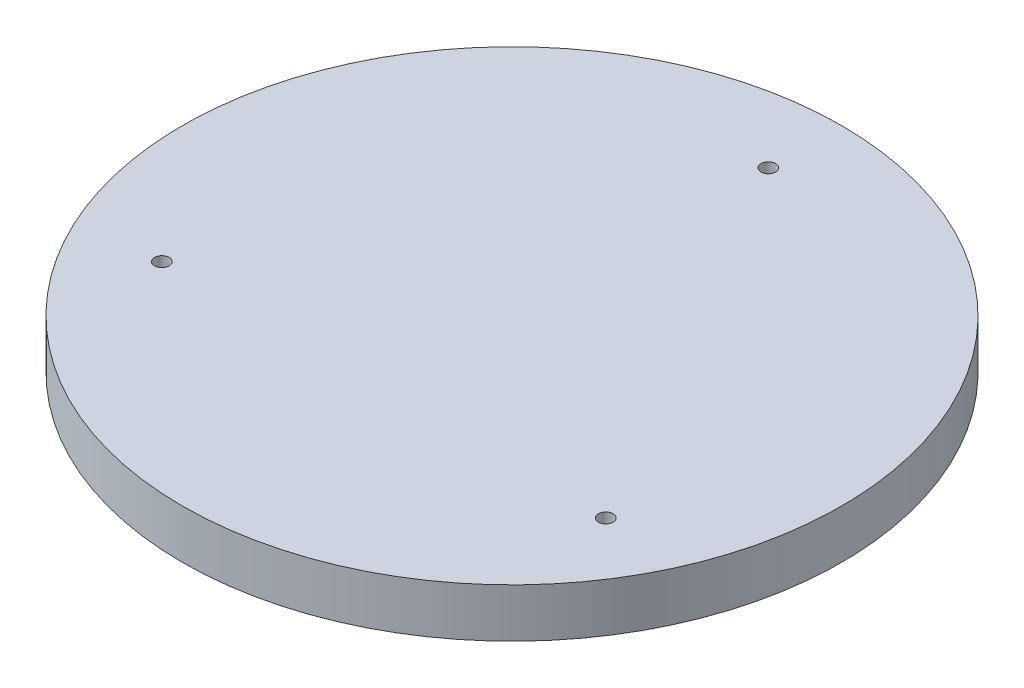
ISO-10303-21;
HEADER;
FILE_DESCRIPTION(('STEP AP214'),'2;1');
FILE_NAME('part.step','',(''),(''),'','','');
FILE_SCHEMA(('AUTOMOTIVE_DESIGN { 1 0 10303 214 1 1 1 1 }'));
ENDSEC;
DATA;
#1=APPLICATION_CONTEXT('core data for automotive mechanical design processes');
#2=APPLICATION_PROTOCOL_DEFINITION('international standard','automotive_design',2000,#1);
#3=PRODUCT_CONTEXT('',#1,'mechanical');
#4=PRODUCT('Part','Part','',(#3));
#5=PRODUCT_RELATED_PRODUCT_CATEGORY('part','',(#4));
#6=PRODUCT_DEFINITION_FORMATION('','',#4);
#7=PRODUCT_DEFINITION_CONTEXT('part definition',#1,'design');
#8=PRODUCT_DEFINITION('design','',#6,#7);
#9=PRODUCT_DEFINITION_SHAPE('','',#8);
#10=(LENGTH_UNIT() NAMED_UNIT(*) SI_UNIT(.MILLI.,.METRE.));
#11=(NAMED_UNIT(*) PLANE_ANGLE_UNIT() SI_UNIT($,.RADIAN.));
#12=(NAMED_UNIT(*) SI_UNIT($,.STERADIAN.) SOLID_ANGLE_UNIT());
#13=UNCERTAINTY_MEASURE_WITH_UNIT(LENGTH_MEASURE(1.E-05),#10,'distance_accuracy_value','');
#14=(GEOMETRIC_REPRESENTATION_CONTEXT(3) GLOBAL_UNCERTAINTY_ASSIGNED_CONTEXT((#13)) GLOBAL_UNIT_ASSIGNED_CONTEXT((#10,
#11,#12)) REPRESENTATION_CONTEXT('',''));
#15=CARTESIAN_POINT('',(0.,0.,0.));
#16=DIRECTION('',(0.,0.,1.));
#17=DIRECTION('',(1.,0.,0.));
#18=AXIS2_PLACEMENT_3D('',#15,#16,#17);
#19=CARTESIAN_POINT('',(0.,10.,0.));
#20=DIRECTION('',(0.,-1.,0.));
#21=DIRECTION('',(0.,0.,-1.));
#22=AXIS2_PLACEMENT_3D('',#19,#20,#21);
#23=CYLINDRICAL_SURFACE('',#22,67.5);
#24=CARTESIAN_POINT('',(0.,10.,0.));
#25=DIRECTION('',(0.,1.,0.));
#26=DIRECTION('',(0.,0.,1.));
#27=AXIS2_PLACEMENT_3D('',#24,#25,#26);
#28=CIRCLE('',#27,67.5);
#29=CARTESIAN_POINT('',(0.,10.,67.5));
#30=VERTEX_POINT('',#29);
#31=EDGE_CURVE('E10',#30,#30,#28,.T.);
#32=ORIENTED_EDGE('',*,*,#31,.F.);
#33=EDGE_LOOP('',(#32));
#34=FACE_BOUND('',#33,.T.);
#35=CARTESIAN_POINT('',(0.,0.,0.));
#36=DIRECTION('',(0.,1.,0.));
#37=DIRECTION('',(0.,0.,1.));
#38=AXIS2_PLACEMENT_3D('',#35,#36,#37);
#39=CIRCLE('',#38,67.5);
#40=CARTESIAN_POINT('',(0.,0.,67.5));
#41=VERTEX_POINT('',#40);
#42=EDGE_CURVE('E40',#41,#41,#39,.T.);
#43=ORIENTED_EDGE('',*,*,#42,.T.);
#44=EDGE_LOOP('',(#43));
#45=FACE_BOUND('',#44,.T.);
#46=ADVANCED_FACE('F37',(#34,#45),#23,.T.);
#47=CARTESIAN_POINT('',(0.,10.,0.));
#48=DIRECTION('',(0.,1.,0.));
#49=DIRECTION('',(0.,0.,1.));
#50=AXIS2_PLACEMENT_3D('',#47,#48,#49);
#51=PLANE('',#50);
#52=CARTESIAN_POINT('',(0.,10.,-52.5));
#53=DIRECTION('',(0.,1.,0.));
#54=DIRECTION('',(0.,0.,1.));
#55=AXIS2_PLACEMENT_3D('',#52,#53,#54);
#56=CIRCLE('',#55,1.5);
#57=CARTESIAN_POINT('',(0.,10.,-51.));
#58=VERTEX_POINT('',#57);
#59=EDGE_CURVE('E67',#58,#58,#56,.T.);
#60=ORIENTED_EDGE('',*,*,#59,.F.);
#61=EDGE_LOOP('',(#60));
#62=FACE_BOUND('',#61,.T.);
#63=CARTESIAN_POINT('',(45.4663336986848,10.,26.2500000000013));
#64=DIRECTION('',(0.,1.,0.));
#65=DIRECTION('',(0.,0.,1.));
#66=AXIS2_PLACEMENT_3D('',#63,#64,#65);
#67=CIRCLE('',#66,1.50000000000002);
#68=CARTESIAN_POINT('',(45.4663336986848,10.,27.7500000000013));
#69=VERTEX_POINT('',#68);
#70=EDGE_CURVE('E59',#69,#69,#67,.T.);
#71=ORIENTED_EDGE('',*,*,#70,.F.);
#72=EDGE_LOOP('',(#71));
#73=FACE_BOUND('',#72,.T.);
#74=CARTESIAN_POINT('',(-45.4663336986833,10.,26.2500000000023));
#75=DIRECTION('',(0.,1.,0.));
#76=DIRECTION('',(0.,0.,1.));
#77=AXIS2_PLACEMENT_3D('',#74,#75,#76);
#78=CIRCLE('',#77,1.5);
#79=CARTESIAN_POINT('',(-45.4663336986833,10.,27.7500000000023));
#80=VERTEX_POINT('',#79);
#81=EDGE_CURVE('E51',#80,#80,#78,.T.);
#82=ORIENTED_EDGE('',*,*,#81,.F.);
#83=EDGE_LOOP('',(#82));
#84=FACE_BOUND('',#83,.T.);
#85=ORIENTED_EDGE('',*,*,#31,.T.);
#86=EDGE_LOOP('',(#85));
#87=FACE_BOUND('',#86,.T.);
#88=ADVANCED_FACE('F85',(#62,#73,#84,#87),#51,.T.);
#89=CARTESIAN_POINT('',(0.,0.,0.));
#90=DIRECTION('',(0.,1.,0.));
#91=DIRECTION('',(0.,0.,1.));
#92=AXIS2_PLACEMENT_3D('',#89,#90,#91);
#93=PLANE('',#92);
#94=CARTESIAN_POINT('',(0.,0.,-52.5));
#95=DIRECTION('',(0.,1.,0.));
#96=DIRECTION('',(0.,0.,1.));
#97=AXIS2_PLACEMENT_3D('',#94,#95,#96);
#98=CIRCLE('',#97,1.5);
#99=CARTESIAN_POINT('',(0.,0.,-51.));
#100=VERTEX_POINT('',#99);
#101=EDGE_CURVE('E49',#100,#100,#98,.T.);
#102=ORIENTED_EDGE('',*,*,#101,.T.);
#103=EDGE_LOOP('',(#102));
#104=FACE_BOUND('',#103,.T.);
#105=CARTESIAN_POINT('',(45.4663336986848,0.,26.2500000000013));
#106=DIRECTION('',(0.,1.,0.));
#107=DIRECTION('',(0.,0.,1.));
#108=AXIS2_PLACEMENT_3D('',#105,#106,#107);
#109=CIRCLE('',#108,1.50000000000002);
#110=CARTESIAN_POINT('',(45.4663336986848,0.,27.7500000000013));
#111=VERTEX_POINT('',#110);
#112=EDGE_CURVE('E63',#111,#111,#109,.T.);
#113=ORIENTED_EDGE('',*,*,#112,.T.);
#114=EDGE_LOOP('',(#113));
#115=FACE_BOUND('',#114,.T.);
#116=CARTESIAN_POINT('',(-45.4663336986833,0.,26.2500000000023));
#117=DIRECTION('',(0.,1.,0.));
#118=DIRECTION('',(0.,0.,1.));
#119=AXIS2_PLACEMENT_3D('',#116,#117,#118);
#120=CIRCLE('',#119,1.5);
#121=CARTESIAN_POINT('',(-45.4663336986833,0.,27.7500000000023));
#122=VERTEX_POINT('',#121);
#123=EDGE_CURVE('E55',#122,#122,#120,.T.);
#124=ORIENTED_EDGE('',*,*,#123,.T.);
#125=EDGE_LOOP('',(#124));
#126=FACE_BOUND('',#125,.T.);
#127=ORIENTED_EDGE('',*,*,#42,.F.);
#128=EDGE_LOOP('',(#127));
#129=FACE_BOUND('',#128,.T.);
#130=ADVANCED_FACE('F75',(#104,#115,#126,#129),#93,.F.);
#131=CARTESIAN_POINT('',(-45.4663336986833,0.,26.2500000000023));
#132=DIRECTION('',(0.,1.,0.));
#133=DIRECTION('',(0.,0.,1.));
#134=AXIS2_PLACEMENT_3D('',#131,#132,#133);
#135=CYLINDRICAL_SURFACE('',#134,1.5);
#136=ORIENTED_EDGE('',*,*,#123,.F.);
#137=EDGE_LOOP('',(#136));
#138=FACE_BOUND('',#137,.T.);
#139=ORIENTED_EDGE('',*,*,#81,.T.);
#140=EDGE_LOOP('',(#139));
#141=FACE_BOUND('',#140,.T.);
#142=ADVANCED_FACE('F93',(#138,#141),#135,.F.);
#143=CARTESIAN_POINT('',(45.4663336986848,0.,26.2500000000013));
#144=DIRECTION('',(0.,1.,0.));
#145=DIRECTION('',(0.,0.,1.));
#146=AXIS2_PLACEMENT_3D('',#143,#144,#145);
#147=CYLINDRICAL_SURFACE('',#146,1.50000000000002);
#148=ORIENTED_EDGE('',*,*,#112,.F.);
#149=EDGE_LOOP('',(#148));
#150=FACE_BOUND('',#149,.T.);
#151=ORIENTED_EDGE('',*,*,#70,.T.);
#152=EDGE_LOOP('',(#151));
#153=FACE_BOUND('',#152,.T.);
#154=ADVANCED_FACE('F81',(#150,#153),#147,.F.);
#155=CARTESIAN_POINT('',(0.,0.,-52.5));
#156=DIRECTION('',(0.,1.,0.));
#157=DIRECTION('',(0.,0.,1.));
#158=AXIS2_PLACEMENT_3D('',#155,#156,#157);
#159=CYLINDRICAL_SURFACE('',#158,1.5);
#160=ORIENTED_EDGE('',*,*,#101,.F.);
#161=EDGE_LOOP('',(#160));
#162=FACE_BOUND('',#161,.T.);
#163=ORIENTED_EDGE('',*,*,#59,.T.);
#164=EDGE_LOOP('',(#163));
#165=FACE_BOUND('',#164,.T.);
#166=ADVANCED_FACE('F78',(#162,#165),#159,.F.);
#167=CLOSED_SHELL('',(#46,#88,#130,#142,#154,#166));
#168=MANIFOLD_SOLID_BREP('B2',#167);
#169=ADVANCED_BREP_SHAPE_REPRESENTATION('',(#18,#168),#14);
#170=SHAPE_DEFINITION_REPRESENTATION(#9,#169);
ENDSEC;
END-ISO-10303-21;
